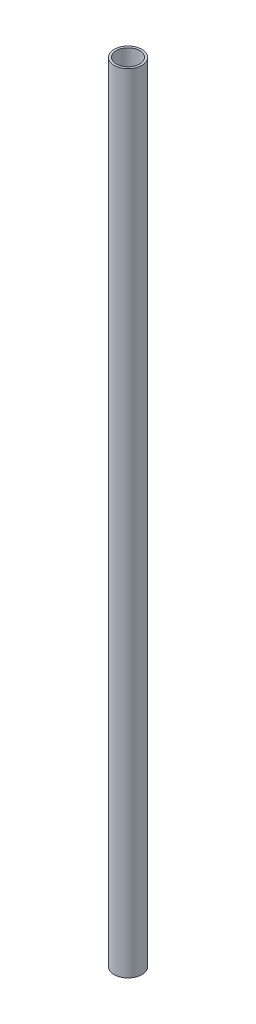
ISO-10303-21;
HEADER;
FILE_DESCRIPTION(('STEP AP214'),'2;1');
FILE_NAME('part.step','',(''),(''),'','','');
FILE_SCHEMA(('AUTOMOTIVE_DESIGN { 1 0 10303 214 1 1 1 1 }'));
ENDSEC;
DATA;
#1=APPLICATION_CONTEXT('core data for automotive mechanical design processes');
#2=APPLICATION_PROTOCOL_DEFINITION('international standard','automotive_design',2000,#1);
#3=PRODUCT_CONTEXT('',#1,'mechanical');
#4=PRODUCT('Part','Part','',(#3));
#5=PRODUCT_RELATED_PRODUCT_CATEGORY('part','',(#4));
#6=PRODUCT_DEFINITION_FORMATION('','',#4);
#7=PRODUCT_DEFINITION_CONTEXT('part definition',#1,'design');
#8=PRODUCT_DEFINITION('design','',#6,#7);
#9=PRODUCT_DEFINITION_SHAPE('','',#8);
#10=(LENGTH_UNIT() NAMED_UNIT(*) SI_UNIT(.MILLI.,.METRE.));
#11=(NAMED_UNIT(*) PLANE_ANGLE_UNIT() SI_UNIT($,.RADIAN.));
#12=(NAMED_UNIT(*) SI_UNIT($,.STERADIAN.) SOLID_ANGLE_UNIT());
#13=UNCERTAINTY_MEASURE_WITH_UNIT(LENGTH_MEASURE(1.E-05),#10,'distance_accuracy_value','');
#14=(GEOMETRIC_REPRESENTATION_CONTEXT(3) GLOBAL_UNCERTAINTY_ASSIGNED_CONTEXT((#13)) GLOBAL_UNIT_ASSIGNED_CONTEXT((#10,
#11,#12)) REPRESENTATION_CONTEXT('',''));
#15=CARTESIAN_POINT('',(0.,0.,0.));
#16=DIRECTION('',(0.,0.,1.));
#17=DIRECTION('',(1.,0.,0.));
#18=AXIS2_PLACEMENT_3D('',#15,#16,#17);
#19=CARTESIAN_POINT('',(0.,450.85,0.));
#20=DIRECTION('',(0.,1.,0.));
#21=DIRECTION('',(0.,0.,1.));
#22=AXIS2_PLACEMENT_3D('',#19,#20,#21);
#23=PLANE('',#22);
#24=CARTESIAN_POINT('',(0.,450.85,0.));
#25=DIRECTION('',(0.,1.,0.));
#26=DIRECTION('',(0.,0.,1.));
#27=AXIS2_PLACEMENT_3D('',#24,#25,#26);
#28=CIRCLE('',#27,7.9375);
#29=CARTESIAN_POINT('',(0.,450.85,-7.9375));
#30=VERTEX_POINT('',#29);
#31=EDGE_CURVE('E10',#30,#30,#28,.T.);
#32=ORIENTED_EDGE('',*,*,#31,.T.);
#33=EDGE_LOOP('',(#32));
#34=FACE_BOUND('',#33,.T.);
#35=CARTESIAN_POINT('',(0.,450.85,0.));
#36=DIRECTION('',(0.,1.,0.));
#37=DIRECTION('',(0.,0.,1.));
#38=AXIS2_PLACEMENT_3D('',#35,#36,#37);
#39=CIRCLE('',#38,6.6929);
#40=CARTESIAN_POINT('',(0.,450.85,-6.6929));
#41=VERTEX_POINT('',#40);
#42=EDGE_CURVE('E48',#41,#41,#39,.T.);
#43=ORIENTED_EDGE('',*,*,#42,.F.);
#44=EDGE_LOOP('',(#43));
#45=FACE_BOUND('',#44,.T.);
#46=ADVANCED_FACE('F37',(#34,#45),#23,.T.);
#47=CARTESIAN_POINT('',(0.,0.,0.));
#48=DIRECTION('',(0.,1.,0.));
#49=DIRECTION('',(0.,0.,1.));
#50=AXIS2_PLACEMENT_3D('',#47,#48,#49);
#51=PLANE('',#50);
#52=CARTESIAN_POINT('',(0.,0.,0.));
#53=DIRECTION('',(0.,1.,0.));
#54=DIRECTION('',(0.,0.,1.));
#55=AXIS2_PLACEMENT_3D('',#52,#53,#54);
#56=CIRCLE('',#55,7.9375);
#57=CARTESIAN_POINT('',(0.,0.,-7.9375));
#58=VERTEX_POINT('',#57);
#59=EDGE_CURVE('E41',#58,#58,#56,.T.);
#60=ORIENTED_EDGE('',*,*,#59,.F.);
#61=EDGE_LOOP('',(#60));
#62=FACE_BOUND('',#61,.T.);
#63=CARTESIAN_POINT('',(0.,0.,0.));
#64=DIRECTION('',(0.,1.,0.));
#65=DIRECTION('',(0.,0.,1.));
#66=AXIS2_PLACEMENT_3D('',#63,#64,#65);
#67=CIRCLE('',#66,6.6929);
#68=CARTESIAN_POINT('',(0.,0.,-6.6929));
#69=VERTEX_POINT('',#68);
#70=EDGE_CURVE('E50',#69,#69,#67,.T.);
#71=ORIENTED_EDGE('',*,*,#70,.T.);
#72=EDGE_LOOP('',(#71));
#73=FACE_BOUND('',#72,.T.);
#74=ADVANCED_FACE('F60',(#62,#73),#51,.F.);
#75=CARTESIAN_POINT('',(0.,450.85,0.));
#76=DIRECTION('',(0.,-1.,0.));
#77=DIRECTION('',(0.,0.,-1.));
#78=AXIS2_PLACEMENT_3D('',#75,#76,#77);
#79=CYLINDRICAL_SURFACE('',#78,7.9375);
#80=CARTESIAN_POINT('',(0.,450.85,-7.9375));
#81=CARTESIAN_POINT('',(0.,446.153645833333,-7.9375));
#82=CARTESIAN_POINT('',(0.,441.457291666667,-7.9375));
#83=CARTESIAN_POINT('',(0.,432.064583333333,-7.9375));
#84=CARTESIAN_POINT('',(0.,427.368229166667,-7.9375));
#85=CARTESIAN_POINT('',(0.,417.975520833333,-7.9375));
#86=CARTESIAN_POINT('',(0.,413.279166666667,-7.9375));
#87=CARTESIAN_POINT('',(0.,403.886458333333,-7.9375));
#88=CARTESIAN_POINT('',(0.,399.190104166667,-7.9375));
#89=CARTESIAN_POINT('',(0.,389.797395833333,-7.9375));
#90=CARTESIAN_POINT('',(0.,385.101041666667,-7.9375));
#91=CARTESIAN_POINT('',(0.,375.708333333333,-7.9375));
#92=CARTESIAN_POINT('',(0.,371.011979166667,-7.9375));
#93=CARTESIAN_POINT('',(0.,361.619270833333,-7.9375));
#94=CARTESIAN_POINT('',(0.,356.922916666667,-7.9375));
#95=CARTESIAN_POINT('',(0.,347.530208333333,-7.9375));
#96=CARTESIAN_POINT('',(0.,342.833854166667,-7.9375));
#97=CARTESIAN_POINT('',(0.,333.441145833333,-7.9375));
#98=CARTESIAN_POINT('',(0.,328.744791666667,-7.9375));
#99=CARTESIAN_POINT('',(0.,319.352083333333,-7.9375));
#100=CARTESIAN_POINT('',(0.,314.655729166667,-7.9375));
#101=CARTESIAN_POINT('',(0.,305.263020833333,-7.9375));
#102=CARTESIAN_POINT('',(0.,300.566666666667,-7.9375));
#103=CARTESIAN_POINT('',(0.,291.173958333333,-7.9375));
#104=CARTESIAN_POINT('',(0.,286.477604166667,-7.9375));
#105=CARTESIAN_POINT('',(0.,277.084895833333,-7.9375));
#106=CARTESIAN_POINT('',(0.,272.388541666667,-7.9375));
#107=CARTESIAN_POINT('',(0.,262.995833333333,-7.9375));
#108=CARTESIAN_POINT('',(0.,258.299479166667,-7.9375));
#109=CARTESIAN_POINT('',(0.,248.906770833333,-7.9375));
#110=CARTESIAN_POINT('',(0.,244.210416666667,-7.9375));
#111=CARTESIAN_POINT('',(0.,234.817708333333,-7.9375));
#112=CARTESIAN_POINT('',(0.,230.121354166667,-7.9375));
#113=CARTESIAN_POINT('',(0.,220.728645833333,-7.9375));
#114=CARTESIAN_POINT('',(0.,216.032291666667,-7.9375));
#115=CARTESIAN_POINT('',(0.,206.639583333333,-7.9375));
#116=CARTESIAN_POINT('',(0.,201.943229166667,-7.9375));
#117=CARTESIAN_POINT('',(0.,192.550520833333,-7.9375));
#118=CARTESIAN_POINT('',(0.,187.854166666667,-7.9375));
#119=CARTESIAN_POINT('',(0.,178.461458333333,-7.9375));
#120=CARTESIAN_POINT('',(0.,173.765104166667,-7.9375));
#121=CARTESIAN_POINT('',(0.,164.372395833333,-7.9375));
#122=CARTESIAN_POINT('',(0.,159.676041666667,-7.9375));
#123=CARTESIAN_POINT('',(0.,150.283333333333,-7.9375));
#124=CARTESIAN_POINT('',(0.,145.586979166667,-7.9375));
#125=CARTESIAN_POINT('',(0.,136.194270833333,-7.9375));
#126=CARTESIAN_POINT('',(0.,131.497916666667,-7.9375));
#127=CARTESIAN_POINT('',(0.,122.105208333333,-7.9375));
#128=CARTESIAN_POINT('',(0.,117.408854166667,-7.9375));
#129=CARTESIAN_POINT('',(0.,108.016145833333,-7.9375));
#130=CARTESIAN_POINT('',(0.,103.319791666667,-7.9375));
#131=CARTESIAN_POINT('',(0.,93.9270833333333,-7.9375));
#132=CARTESIAN_POINT('',(0.,89.2307291666666,-7.9375));
#133=CARTESIAN_POINT('',(0.,79.8380208333333,-7.9375));
#134=CARTESIAN_POINT('',(0.,75.1416666666666,-7.9375));
#135=CARTESIAN_POINT('',(0.,65.7489583333333,-7.9375));
#136=CARTESIAN_POINT('',(0.,61.0526041666666,-7.9375));
#137=CARTESIAN_POINT('',(0.,51.6598958333333,-7.9375));
#138=CARTESIAN_POINT('',(0.,46.9635416666666,-7.9375));
#139=CARTESIAN_POINT('',(0.,37.5708333333333,-7.9375));
#140=CARTESIAN_POINT('',(0.,32.8744791666666,-7.9375));
#141=CARTESIAN_POINT('',(0.,23.4817708333333,-7.9375));
#142=CARTESIAN_POINT('',(0.,18.7854166666666,-7.9375));
#143=CARTESIAN_POINT('',(0.,9.39270833333329,-7.9375));
#144=CARTESIAN_POINT('',(0.,4.69635416666661,-7.9375));
#145=CARTESIAN_POINT('',(0.,0.,-7.9375));
#146=B_SPLINE_CURVE_WITH_KNOTS('',3,(#80,#81,#82,#83,#84,#85,#86,#87,#88,#89,#90,#91,#92,#93,
#94,#95,#96,#97,#98,#99,#100,#101,#102,#103,#104,#105,#106,#107,#108,#109,#110,#111,#112,#113,
#114,#115,#116,#117,#118,#119,#120,#121,#122,#123,#124,#125,#126,#127,#128,#129,#130,#131,#132,
#133,#134,#135,#136,#137,#138,#139,#140,#141,#142,#143,#144,#145),.UNSPECIFIED.,.F.,.F.,(4,2,2,
2,2,2,2,2,2,2,2,2,2,2,2,2,2,2,2,2,2,2,2,2,2,2,2,2,2,2,2,2,4),(0.,14.0890625,28.1781250000001,
42.2671875,56.3562500000001,70.4453125,84.5343750000001,98.6234375,112.7125,126.8015625,
140.890625,154.9796875,169.06875,183.1578125,197.246875,211.3359375,225.425,239.5140625,
253.603125,267.6921875,281.78125,295.8703125,309.959375,324.0484375,338.1375,352.2265625,
366.315625,380.4046875,394.49375,408.5828125,422.671875,436.7609375,450.85),.UNSPECIFIED.);
#147=EDGE_CURVE('BSEAM39',#30,#58,#146,.T.);
#148=ORIENTED_EDGE('',*,*,#31,.F.);
#149=ORIENTED_EDGE('',*,*,#59,.T.);
#150=ORIENTED_EDGE('',*,*,#147,.T.);
#151=ORIENTED_EDGE('',*,*,#147,.F.);
#152=EDGE_LOOP('',(#148,#150,#149,#151));
#153=FACE_BOUND('',#152,.T.);
#154=ADVANCED_FACE('F39',(#153),#79,.T.);
#155=CARTESIAN_POINT('',(0.,450.85,0.));
#156=DIRECTION('',(0.,-1.,0.));
#157=DIRECTION('',(0.,0.,-1.));
#158=AXIS2_PLACEMENT_3D('',#155,#156,#157);
#159=CYLINDRICAL_SURFACE('',#158,6.6929);
#160=CARTESIAN_POINT('',(0.,450.85,-6.6929));
#161=CARTESIAN_POINT('',(0.,446.153645833333,-6.6929));
#162=CARTESIAN_POINT('',(0.,441.457291666667,-6.6929));
#163=CARTESIAN_POINT('',(0.,432.064583333333,-6.6929));
#164=CARTESIAN_POINT('',(0.,427.368229166667,-6.6929));
#165=CARTESIAN_POINT('',(0.,417.975520833333,-6.6929));
#166=CARTESIAN_POINT('',(0.,413.279166666667,-6.6929));
#167=CARTESIAN_POINT('',(0.,403.886458333333,-6.6929));
#168=CARTESIAN_POINT('',(0.,399.190104166667,-6.6929));
#169=CARTESIAN_POINT('',(0.,389.797395833333,-6.6929));
#170=CARTESIAN_POINT('',(0.,385.101041666667,-6.6929));
#171=CARTESIAN_POINT('',(0.,375.708333333333,-6.6929));
#172=CARTESIAN_POINT('',(0.,371.011979166667,-6.6929));
#173=CARTESIAN_POINT('',(0.,361.619270833333,-6.6929));
#174=CARTESIAN_POINT('',(0.,356.922916666667,-6.6929));
#175=CARTESIAN_POINT('',(0.,347.530208333333,-6.6929));
#176=CARTESIAN_POINT('',(0.,342.833854166667,-6.6929));
#177=CARTESIAN_POINT('',(0.,333.441145833333,-6.6929));
#178=CARTESIAN_POINT('',(0.,328.744791666667,-6.6929));
#179=CARTESIAN_POINT('',(0.,319.352083333333,-6.6929));
#180=CARTESIAN_POINT('',(0.,314.655729166667,-6.6929));
#181=CARTESIAN_POINT('',(0.,305.263020833333,-6.6929));
#182=CARTESIAN_POINT('',(0.,300.566666666667,-6.6929));
#183=CARTESIAN_POINT('',(0.,291.173958333333,-6.6929));
#184=CARTESIAN_POINT('',(0.,286.477604166667,-6.6929));
#185=CARTESIAN_POINT('',(0.,277.084895833333,-6.6929));
#186=CARTESIAN_POINT('',(0.,272.388541666667,-6.6929));
#187=CARTESIAN_POINT('',(0.,262.995833333333,-6.6929));
#188=CARTESIAN_POINT('',(0.,258.299479166667,-6.6929));
#189=CARTESIAN_POINT('',(0.,248.906770833333,-6.6929));
#190=CARTESIAN_POINT('',(0.,244.210416666667,-6.6929));
#191=CARTESIAN_POINT('',(0.,234.817708333333,-6.6929));
#192=CARTESIAN_POINT('',(0.,230.121354166667,-6.6929));
#193=CARTESIAN_POINT('',(0.,220.728645833333,-6.6929));
#194=CARTESIAN_POINT('',(0.,216.032291666667,-6.6929));
#195=CARTESIAN_POINT('',(0.,206.639583333333,-6.6929));
#196=CARTESIAN_POINT('',(0.,201.943229166667,-6.6929));
#197=CARTESIAN_POINT('',(0.,192.550520833333,-6.6929));
#198=CARTESIAN_POINT('',(0.,187.854166666667,-6.6929));
#199=CARTESIAN_POINT('',(0.,178.461458333333,-6.6929));
#200=CARTESIAN_POINT('',(0.,173.765104166667,-6.6929));
#201=CARTESIAN_POINT('',(0.,164.372395833333,-6.6929));
#202=CARTESIAN_POINT('',(0.,159.676041666667,-6.6929));
#203=CARTESIAN_POINT('',(0.,150.283333333333,-6.6929));
#204=CARTESIAN_POINT('',(0.,145.586979166667,-6.6929));
#205=CARTESIAN_POINT('',(0.,136.194270833333,-6.6929));
#206=CARTESIAN_POINT('',(0.,131.497916666667,-6.6929));
#207=CARTESIAN_POINT('',(0.,122.105208333333,-6.6929));
#208=CARTESIAN_POINT('',(0.,117.408854166667,-6.6929));
#209=CARTESIAN_POINT('',(0.,108.016145833333,-6.6929));
#210=CARTESIAN_POINT('',(0.,103.319791666667,-6.6929));
#211=CARTESIAN_POINT('',(0.,93.9270833333333,-6.6929));
#212=CARTESIAN_POINT('',(0.,89.2307291666666,-6.6929));
#213=CARTESIAN_POINT('',(0.,79.8380208333333,-6.6929));
#214=CARTESIAN_POINT('',(0.,75.1416666666666,-6.6929));
#215=CARTESIAN_POINT('',(0.,65.7489583333333,-6.6929));
#216=CARTESIAN_POINT('',(0.,61.0526041666666,-6.6929));
#217=CARTESIAN_POINT('',(0.,51.6598958333333,-6.6929));
#218=CARTESIAN_POINT('',(0.,46.9635416666666,-6.6929));
#219=CARTESIAN_POINT('',(0.,37.5708333333333,-6.6929));
#220=CARTESIAN_POINT('',(0.,32.8744791666666,-6.6929));
#221=CARTESIAN_POINT('',(0.,23.4817708333333,-6.6929));
#222=CARTESIAN_POINT('',(0.,18.7854166666666,-6.6929));
#223=CARTESIAN_POINT('',(0.,9.39270833333329,-6.6929));
#224=CARTESIAN_POINT('',(0.,4.69635416666661,-6.6929));
#225=CARTESIAN_POINT('',(0.,0.,-6.6929));
#226=B_SPLINE_CURVE_WITH_KNOTS('',3,(#160,#161,#162,#163,#164,#165,#166,#167,#168,#169,#170,
#171,#172,#173,#174,#175,#176,#177,#178,#179,#180,#181,#182,#183,#184,#185,#186,#187,#188,#189,
#190,#191,#192,#193,#194,#195,#196,#197,#198,#199,#200,#201,#202,#203,#204,#205,#206,#207,#208,
#209,#210,#211,#212,#213,#214,#215,#216,#217,#218,#219,#220,#221,#222,#223,#224,#225),
.UNSPECIFIED.,.F.,.F.,(4,2,2,2,2,2,2,2,2,2,2,2,2,2,2,2,2,2,2,2,2,2,2,2,2,2,2,2,2,2,2,2,4),(0.,
14.0890625,28.178125,42.2671875,56.3562499999999,70.4453125,84.534375,98.6234375,112.7125,
126.8015625,140.890625,154.9796875,169.06875,183.1578125,197.246875,211.3359375,225.425,
239.5140625,253.603125,267.6921875,281.78125,295.8703125,309.959375,324.0484375,338.1375,
352.2265625,366.315625,380.4046875,394.49375,408.5828125,422.671875,436.7609375,450.85),.UNSPECIFIED.);
#227=EDGE_CURVE('BSEAM56',#41,#69,#226,.T.);
#228=ORIENTED_EDGE('',*,*,#42,.T.);
#229=ORIENTED_EDGE('',*,*,#70,.F.);
#230=ORIENTED_EDGE('',*,*,#227,.T.);
#231=ORIENTED_EDGE('',*,*,#227,.F.);
#232=EDGE_LOOP('',(#228,#230,#229,#231));
#233=FACE_BOUND('',#232,.T.);
#234=ADVANCED_FACE('F56',(#233),#159,.F.);
#235=CLOSED_SHELL('',(#46,#74,#154,#234));
#236=MANIFOLD_SOLID_BREP('B2',#235);
#237=ADVANCED_BREP_SHAPE_REPRESENTATION('',(#18,#236),#14);
#238=SHAPE_DEFINITION_REPRESENTATION(#9,#237);
ENDSEC;
END-ISO-10303-21;
